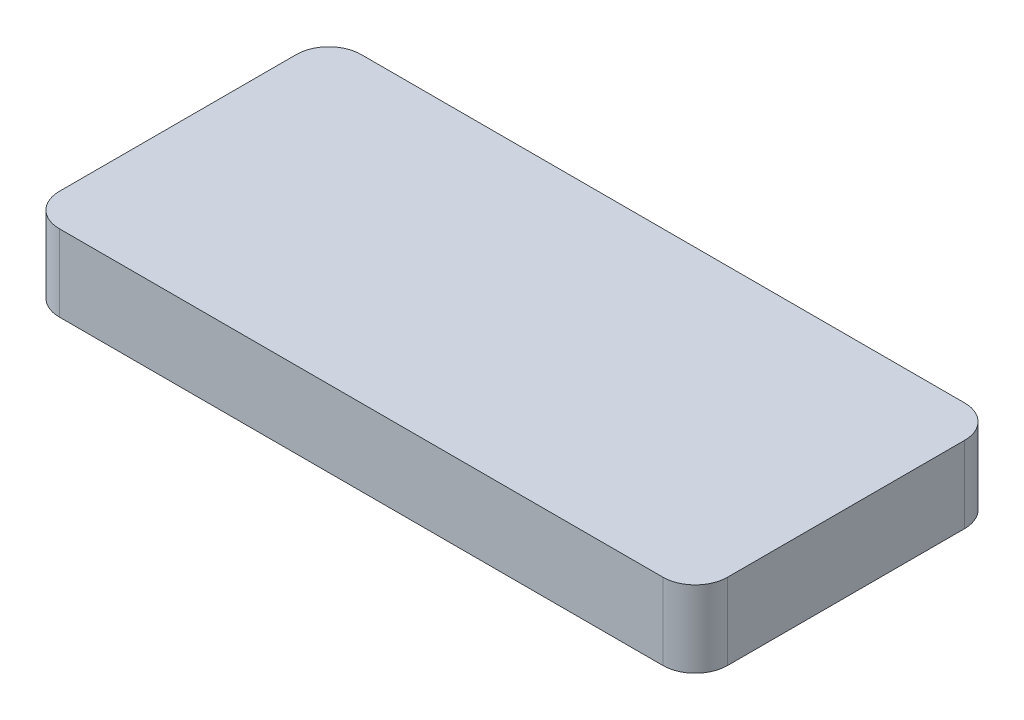
ISO-10303-21;
HEADER;
FILE_DESCRIPTION(('STEP AP214'),'2;1');
FILE_NAME('part.step','',(''),(''),'','','');
FILE_SCHEMA(('AUTOMOTIVE_DESIGN { 1 0 10303 214 1 1 1 1 }'));
ENDSEC;
DATA;
#1=APPLICATION_CONTEXT('core data for automotive mechanical design processes');
#2=APPLICATION_PROTOCOL_DEFINITION('international standard','automotive_design',2000,#1);
#3=PRODUCT_CONTEXT('',#1,'mechanical');
#4=PRODUCT('Part','Part','',(#3));
#5=PRODUCT_RELATED_PRODUCT_CATEGORY('part','',(#4));
#6=PRODUCT_DEFINITION_FORMATION('','',#4);
#7=PRODUCT_DEFINITION_CONTEXT('part definition',#1,'design');
#8=PRODUCT_DEFINITION('design','',#6,#7);
#9=PRODUCT_DEFINITION_SHAPE('','',#8);
#10=(LENGTH_UNIT() NAMED_UNIT(*) SI_UNIT(.MILLI.,.METRE.));
#11=(NAMED_UNIT(*) PLANE_ANGLE_UNIT() SI_UNIT($,.RADIAN.));
#12=(NAMED_UNIT(*) SI_UNIT($,.STERADIAN.) SOLID_ANGLE_UNIT());
#13=UNCERTAINTY_MEASURE_WITH_UNIT(LENGTH_MEASURE(1.E-05),#10,'distance_accuracy_value','');
#14=(GEOMETRIC_REPRESENTATION_CONTEXT(3) GLOBAL_UNCERTAINTY_ASSIGNED_CONTEXT((#13)) GLOBAL_UNIT_ASSIGNED_CONTEXT((#10,
#11,#12)) REPRESENTATION_CONTEXT('',''));
#15=CARTESIAN_POINT('',(0.,0.,0.));
#16=DIRECTION('',(0.,0.,1.));
#17=DIRECTION('',(1.,0.,0.));
#18=AXIS2_PLACEMENT_3D('',#15,#16,#17);
#19=CARTESIAN_POINT('',(0.,3.55,0.));
#20=DIRECTION('',(0.,1.,0.));
#21=DIRECTION('',(1.,0.,0.));
#22=AXIS2_PLACEMENT_3D('',#19,#20,#21);
#23=PLANE('',#22);
#24=CARTESIAN_POINT('',(-14.,3.55,12.5));
#25=DIRECTION('',(0.,-1.,0.));
#26=DIRECTION('',(0.,0.,1.));
#27=AXIS2_PLACEMENT_3D('',#24,#25,#26);
#28=CIRCLE('',#27,1.5);
#29=CARTESIAN_POINT('',(-14.,3.55,14.));
#30=VERTEX_POINT('',#29);
#31=CARTESIAN_POINT('',(-15.5,3.55,12.5));
#32=VERTEX_POINT('',#31);
#33=EDGE_CURVE('E11',#30,#32,#28,.T.);
#34=ORIENTED_EDGE('',*,*,#33,.F.);
#35=DIRECTION('',(1.,0.,0.));
#36=VECTOR('',#35,1.);
#37=CARTESIAN_POINT('',(-14.,3.55,14.));
#38=LINE('',#37,#36);
#39=CARTESIAN_POINT('',(14.,3.55,14.));
#40=VERTEX_POINT('',#39);
#41=EDGE_CURVE('E46',#30,#40,#38,.T.);
#42=ORIENTED_EDGE('',*,*,#41,.T.);
#43=CARTESIAN_POINT('',(14.,3.55,12.5));
#44=DIRECTION('',(0.,-1.,0.));
#45=DIRECTION('',(1.,0.,0.));
#46=AXIS2_PLACEMENT_3D('',#43,#44,#45);
#47=CIRCLE('',#46,1.5);
#48=CARTESIAN_POINT('',(15.5,3.55,12.5));
#49=VERTEX_POINT('',#48);
#50=EDGE_CURVE('E106',#49,#40,#47,.T.);
#51=ORIENTED_EDGE('',*,*,#50,.F.);
#52=DIRECTION('',(0.,0.,-1.));
#53=VECTOR('',#52,1.);
#54=CARTESIAN_POINT('',(15.5,3.55,12.5));
#55=LINE('',#54,#53);
#56=CARTESIAN_POINT('',(15.5,3.55,1.5));
#57=VERTEX_POINT('',#56);
#58=EDGE_CURVE('E100',#49,#57,#55,.T.);
#59=ORIENTED_EDGE('',*,*,#58,.T.);
#60=CARTESIAN_POINT('',(14.,3.55,1.5));
#61=DIRECTION('',(0.,-1.,0.));
#62=DIRECTION('',(0.,0.,-1.));
#63=AXIS2_PLACEMENT_3D('',#60,#61,#62);
#64=CIRCLE('',#63,1.5);
#65=CARTESIAN_POINT('',(14.,3.55,0.));
#66=VERTEX_POINT('',#65);
#67=EDGE_CURVE('E103',#66,#57,#64,.T.);
#68=ORIENTED_EDGE('',*,*,#67,.F.);
#69=DIRECTION('',(-1.,0.,0.));
#70=VECTOR('',#69,1.);
#71=CARTESIAN_POINT('',(14.,3.55,0.));
#72=LINE('',#71,#70);
#73=CARTESIAN_POINT('',(-14.,3.55,0.));
#74=VERTEX_POINT('',#73);
#75=EDGE_CURVE('E131',#66,#74,#72,.T.);
#76=ORIENTED_EDGE('',*,*,#75,.T.);
#77=CARTESIAN_POINT('',(-14.,3.55,1.5));
#78=DIRECTION('',(0.,-1.,0.));
#79=DIRECTION('',(-1.,0.,0.));
#80=AXIS2_PLACEMENT_3D('',#77,#78,#79);
#81=CIRCLE('',#80,1.5);
#82=CARTESIAN_POINT('',(-15.5,3.55,1.5));
#83=VERTEX_POINT('',#82);
#84=EDGE_CURVE('E159',#83,#74,#81,.T.);
#85=ORIENTED_EDGE('',*,*,#84,.F.);
#86=DIRECTION('',(0.,0.,1.));
#87=VECTOR('',#86,1.);
#88=CARTESIAN_POINT('',(-15.5,3.55,1.5));
#89=LINE('',#88,#87);
#90=EDGE_CURVE('E157',#83,#32,#89,.T.);
#91=ORIENTED_EDGE('',*,*,#90,.T.);
#92=EDGE_LOOP('',(#34,#42,#51,#59,#68,#76,#85,#91));
#93=FACE_BOUND('',#92,.T.);
#94=ADVANCED_FACE('F17',(#93),#23,.T.);
#95=CARTESIAN_POINT('',(-14.,0.,12.5));
#96=DIRECTION('',(0.,-1.,0.));
#97=DIRECTION('',(0.,0.,1.));
#98=AXIS2_PLACEMENT_3D('',#95,#96,#97);
#99=CYLINDRICAL_SURFACE('',#98,1.5);
#100=ORIENTED_EDGE('',*,*,#33,.T.);
#101=DIRECTION('',(0.,1.,0.));
#102=VECTOR('',#101,1.);
#103=CARTESIAN_POINT('',(-15.5,0.,12.5));
#104=LINE('',#103,#102);
#105=CARTESIAN_POINT('',(-15.5,0.,12.5));
#106=VERTEX_POINT('',#105);
#107=EDGE_CURVE('E155',#106,#32,#104,.T.);
#108=ORIENTED_EDGE('',*,*,#107,.F.);
#109=CARTESIAN_POINT('',(-14.,0.,12.5));
#110=DIRECTION('',(0.,-1.,0.));
#111=DIRECTION('',(0.,0.,1.));
#112=AXIS2_PLACEMENT_3D('',#109,#110,#111);
#113=CIRCLE('',#112,1.5);
#114=CARTESIAN_POINT('',(-14.,0.,14.));
#115=VERTEX_POINT('',#114);
#116=EDGE_CURVE('E192',#115,#106,#113,.T.);
#117=ORIENTED_EDGE('',*,*,#116,.F.);
#118=DIRECTION('',(0.,1.,0.));
#119=VECTOR('',#118,1.);
#120=CARTESIAN_POINT('',(-14.,0.,14.));
#121=LINE('',#120,#119);
#122=EDGE_CURVE('E26',#115,#30,#121,.T.);
#123=ORIENTED_EDGE('',*,*,#122,.T.);
#124=EDGE_LOOP('',(#100,#108,#117,#123));
#125=FACE_BOUND('',#124,.T.);
#126=ADVANCED_FACE('F19',(#125),#99,.T.);
#127=CARTESIAN_POINT('',(-15.5,0.,14.));
#128=DIRECTION('',(0.,0.,1.));
#129=DIRECTION('',(1.,0.,0.));
#130=AXIS2_PLACEMENT_3D('',#127,#128,#129);
#131=PLANE('',#130);
#132=DIRECTION('',(0.,1.,0.));
#133=VECTOR('',#132,1.);
#134=CARTESIAN_POINT('',(14.,0.,14.));
#135=LINE('',#134,#133);
#136=CARTESIAN_POINT('',(14.,0.,14.));
#137=VERTEX_POINT('',#136);
#138=EDGE_CURVE('E138',#137,#40,#135,.T.);
#139=ORIENTED_EDGE('',*,*,#138,.T.);
#140=ORIENTED_EDGE('',*,*,#41,.F.);
#141=ORIENTED_EDGE('',*,*,#122,.F.);
#142=DIRECTION('',(1.,0.,0.));
#143=VECTOR('',#142,1.);
#144=CARTESIAN_POINT('',(-14.,0.,14.));
#145=LINE('',#144,#143);
#146=EDGE_CURVE('E189',#115,#137,#145,.T.);
#147=ORIENTED_EDGE('',*,*,#146,.T.);
#148=EDGE_LOOP('',(#139,#140,#141,#147));
#149=FACE_BOUND('',#148,.T.);
#150=ADVANCED_FACE('F206',(#149),#131,.T.);
#151=CARTESIAN_POINT('',(14.,0.,12.5));
#152=DIRECTION('',(0.,-1.,0.));
#153=DIRECTION('',(1.,0.,0.));
#154=AXIS2_PLACEMENT_3D('',#151,#152,#153);
#155=CYLINDRICAL_SURFACE('',#154,1.5);
#156=ORIENTED_EDGE('',*,*,#50,.T.);
#157=ORIENTED_EDGE('',*,*,#138,.F.);
#158=CARTESIAN_POINT('',(14.,0.,12.5));
#159=DIRECTION('',(0.,-1.,0.));
#160=DIRECTION('',(1.,0.,0.));
#161=AXIS2_PLACEMENT_3D('',#158,#159,#160);
#162=CIRCLE('',#161,1.5);
#163=CARTESIAN_POINT('',(15.5,0.,12.5));
#164=VERTEX_POINT('',#163);
#165=EDGE_CURVE('E185',#164,#137,#162,.T.);
#166=ORIENTED_EDGE('',*,*,#165,.F.);
#167=DIRECTION('',(0.,1.,0.));
#168=VECTOR('',#167,1.);
#169=CARTESIAN_POINT('',(15.5,0.,12.5));
#170=LINE('',#169,#168);
#171=EDGE_CURVE('E110',#164,#49,#170,.T.);
#172=ORIENTED_EDGE('',*,*,#171,.T.);
#173=EDGE_LOOP('',(#156,#157,#166,#172));
#174=FACE_BOUND('',#173,.T.);
#175=ADVANCED_FACE('F208',(#174),#155,.T.);
#176=CARTESIAN_POINT('',(15.5,0.,14.));
#177=DIRECTION('',(1.,0.,0.));
#178=DIRECTION('',(0.,1.,0.));
#179=AXIS2_PLACEMENT_3D('',#176,#177,#178);
#180=PLANE('',#179);
#181=DIRECTION('',(0.,1.,0.));
#182=VECTOR('',#181,1.);
#183=CARTESIAN_POINT('',(15.5,0.,1.5));
#184=LINE('',#183,#182);
#185=CARTESIAN_POINT('',(15.5,0.,1.5));
#186=VERTEX_POINT('',#185);
#187=EDGE_CURVE('E111',#186,#57,#184,.T.);
#188=ORIENTED_EDGE('',*,*,#187,.T.);
#189=ORIENTED_EDGE('',*,*,#58,.F.);
#190=ORIENTED_EDGE('',*,*,#171,.F.);
#191=DIRECTION('',(0.,0.,-1.));
#192=VECTOR('',#191,1.);
#193=CARTESIAN_POINT('',(15.5,0.,12.5));
#194=LINE('',#193,#192);
#195=EDGE_CURVE('E116',#164,#186,#194,.T.);
#196=ORIENTED_EDGE('',*,*,#195,.T.);
#197=EDGE_LOOP('',(#188,#189,#190,#196));
#198=FACE_BOUND('',#197,.T.);
#199=ADVANCED_FACE('F114',(#198),#180,.T.);
#200=CARTESIAN_POINT('',(14.,0.,1.5));
#201=DIRECTION('',(0.,-1.,0.));
#202=DIRECTION('',(0.,0.,-1.));
#203=AXIS2_PLACEMENT_3D('',#200,#201,#202);
#204=CYLINDRICAL_SURFACE('',#203,1.5);
#205=ORIENTED_EDGE('',*,*,#67,.T.);
#206=ORIENTED_EDGE('',*,*,#187,.F.);
#207=CARTESIAN_POINT('',(14.,0.,1.5));
#208=DIRECTION('',(0.,-1.,0.));
#209=DIRECTION('',(0.,0.,-1.));
#210=AXIS2_PLACEMENT_3D('',#207,#208,#209);
#211=CIRCLE('',#210,1.5);
#212=CARTESIAN_POINT('',(14.,0.,0.));
#213=VERTEX_POINT('',#212);
#214=EDGE_CURVE('E180',#213,#186,#211,.T.);
#215=ORIENTED_EDGE('',*,*,#214,.F.);
#216=DIRECTION('',(0.,1.,0.));
#217=VECTOR('',#216,1.);
#218=CARTESIAN_POINT('',(14.,0.,0.));
#219=LINE('',#218,#217);
#220=EDGE_CURVE('E123',#213,#66,#219,.T.);
#221=ORIENTED_EDGE('',*,*,#220,.T.);
#222=EDGE_LOOP('',(#205,#206,#215,#221));
#223=FACE_BOUND('',#222,.T.);
#224=ADVANCED_FACE('F122',(#223),#204,.T.);
#225=CARTESIAN_POINT('',(15.5,0.,0.));
#226=DIRECTION('',(0.,0.,-1.));
#227=DIRECTION('',(0.,-1.,0.));
#228=AXIS2_PLACEMENT_3D('',#225,#226,#227);
#229=PLANE('',#228);
#230=DIRECTION('',(0.,1.,0.));
#231=VECTOR('',#230,1.);
#232=CARTESIAN_POINT('',(-14.,0.,0.));
#233=LINE('',#232,#231);
#234=CARTESIAN_POINT('',(-14.,0.,0.));
#235=VERTEX_POINT('',#234);
#236=EDGE_CURVE('E162',#235,#74,#233,.T.);
#237=ORIENTED_EDGE('',*,*,#236,.T.);
#238=ORIENTED_EDGE('',*,*,#75,.F.);
#239=ORIENTED_EDGE('',*,*,#220,.F.);
#240=DIRECTION('',(-1.,0.,0.));
#241=VECTOR('',#240,1.);
#242=CARTESIAN_POINT('',(14.,0.,0.));
#243=LINE('',#242,#241);
#244=EDGE_CURVE('E178',#213,#235,#243,.T.);
#245=ORIENTED_EDGE('',*,*,#244,.T.);
#246=EDGE_LOOP('',(#237,#238,#239,#245));
#247=FACE_BOUND('',#246,.T.);
#248=ADVANCED_FACE('F228',(#247),#229,.T.);
#249=CARTESIAN_POINT('',(-14.,0.,1.5));
#250=DIRECTION('',(0.,-1.,0.));
#251=DIRECTION('',(-1.,0.,0.));
#252=AXIS2_PLACEMENT_3D('',#249,#250,#251);
#253=CYLINDRICAL_SURFACE('',#252,1.5);
#254=ORIENTED_EDGE('',*,*,#84,.T.);
#255=ORIENTED_EDGE('',*,*,#236,.F.);
#256=CARTESIAN_POINT('',(-14.,0.,1.5));
#257=DIRECTION('',(0.,-1.,0.));
#258=DIRECTION('',(-1.,0.,0.));
#259=AXIS2_PLACEMENT_3D('',#256,#257,#258);
#260=CIRCLE('',#259,1.5);
#261=CARTESIAN_POINT('',(-15.5,0.,1.5));
#262=VERTEX_POINT('',#261);
#263=EDGE_CURVE('E299',#262,#235,#260,.T.);
#264=ORIENTED_EDGE('',*,*,#263,.F.);
#265=DIRECTION('',(0.,1.,0.));
#266=VECTOR('',#265,1.);
#267=CARTESIAN_POINT('',(-15.5,0.,1.5));
#268=LINE('',#267,#266);
#269=EDGE_CURVE('E153',#262,#83,#268,.T.);
#270=ORIENTED_EDGE('',*,*,#269,.T.);
#271=EDGE_LOOP('',(#254,#255,#264,#270));
#272=FACE_BOUND('',#271,.T.);
#273=ADVANCED_FACE('F225',(#272),#253,.T.);
#274=CARTESIAN_POINT('',(-15.5,0.,0.));
#275=DIRECTION('',(-1.,0.,0.));
#276=DIRECTION('',(0.,0.,1.));
#277=AXIS2_PLACEMENT_3D('',#274,#275,#276);
#278=PLANE('',#277);
#279=ORIENTED_EDGE('',*,*,#107,.T.);
#280=ORIENTED_EDGE('',*,*,#90,.F.);
#281=ORIENTED_EDGE('',*,*,#269,.F.);
#282=DIRECTION('',(0.,0.,1.));
#283=VECTOR('',#282,1.);
#284=CARTESIAN_POINT('',(-15.5,0.,1.5));
#285=LINE('',#284,#283);
#286=EDGE_CURVE('E158',#262,#106,#285,.T.);
#287=ORIENTED_EDGE('',*,*,#286,.T.);
#288=EDGE_LOOP('',(#279,#280,#281,#287));
#289=FACE_BOUND('',#288,.T.);
#290=ADVANCED_FACE('F199',(#289),#278,.T.);
#291=CARTESIAN_POINT('',(0.,0.,0.));
#292=DIRECTION('',(0.,1.,0.));
#293=DIRECTION('',(1.,0.,0.));
#294=AXIS2_PLACEMENT_3D('',#291,#292,#293);
#295=PLANE('',#294);
#296=ORIENTED_EDGE('',*,*,#263,.T.);
#297=ORIENTED_EDGE('',*,*,#244,.F.);
#298=ORIENTED_EDGE('',*,*,#214,.T.);
#299=ORIENTED_EDGE('',*,*,#195,.F.);
#300=ORIENTED_EDGE('',*,*,#165,.T.);
#301=ORIENTED_EDGE('',*,*,#146,.F.);
#302=ORIENTED_EDGE('',*,*,#116,.T.);
#303=ORIENTED_EDGE('',*,*,#286,.F.);
#304=EDGE_LOOP('',(#296,#297,#298,#299,#300,#301,#302,#303));
#305=FACE_BOUND('',#304,.T.);
#306=ADVANCED_FACE('F204',(#305),#295,.F.);
#307=CLOSED_SHELL('',(#94,#126,#150,#175,#199,#224,#248,#273,#290,#306));
#308=MANIFOLD_SOLID_BREP('B1',#307);
#309=ADVANCED_BREP_SHAPE_REPRESENTATION('',(#18,#308),#14);
#310=SHAPE_DEFINITION_REPRESENTATION(#9,#309);
ENDSEC;
END-ISO-10303-21;
